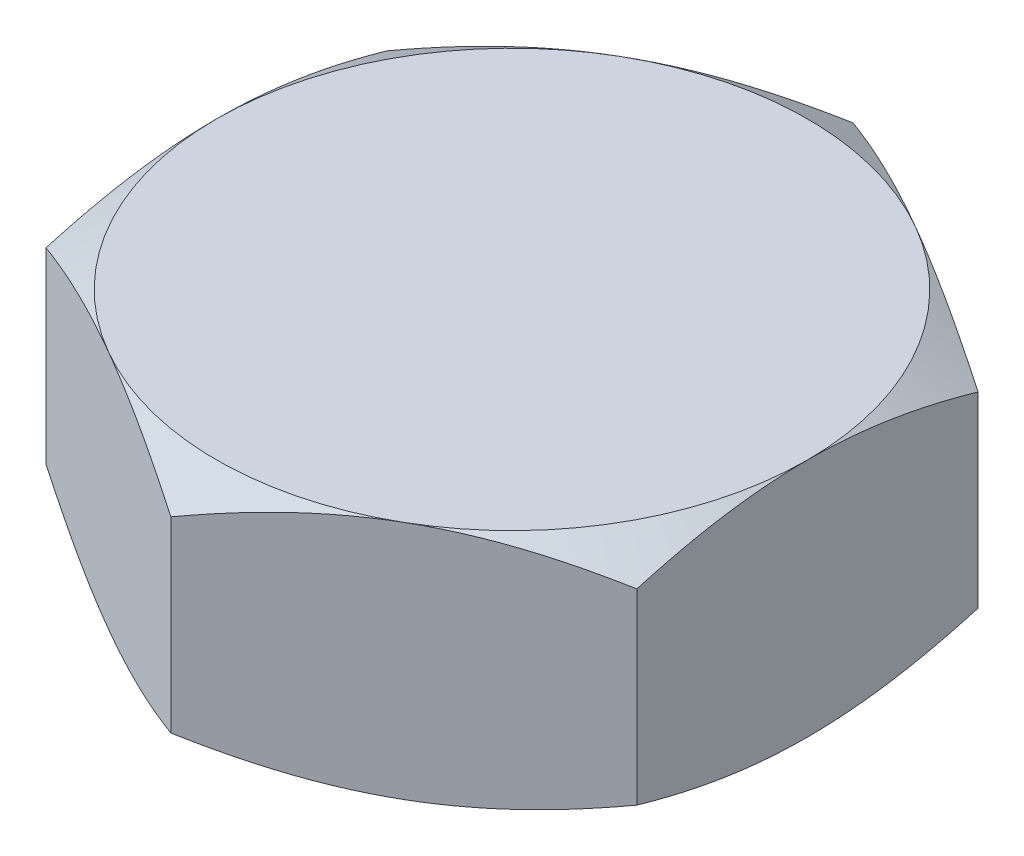
ISO-10303-21;
HEADER;
FILE_DESCRIPTION(('STEP AP214'),'2;1');
FILE_NAME('part.step','',(''),(''),'','','');
FILE_SCHEMA(('AUTOMOTIVE_DESIGN { 1 0 10303 214 1 1 1 1 }'));
ENDSEC;
DATA;
#1=APPLICATION_CONTEXT('core data for automotive mechanical design processes');
#2=APPLICATION_PROTOCOL_DEFINITION('international standard','automotive_design',2000,#1);
#3=PRODUCT_CONTEXT('',#1,'mechanical');
#4=PRODUCT('Part','Part','',(#3));
#5=PRODUCT_RELATED_PRODUCT_CATEGORY('part','',(#4));
#6=PRODUCT_DEFINITION_FORMATION('','',#4);
#7=PRODUCT_DEFINITION_CONTEXT('part definition',#1,'design');
#8=PRODUCT_DEFINITION('design','',#6,#7);
#9=PRODUCT_DEFINITION_SHAPE('','',#8);
#10=(LENGTH_UNIT() NAMED_UNIT(*) SI_UNIT(.MILLI.,.METRE.));
#11=(NAMED_UNIT(*) PLANE_ANGLE_UNIT() SI_UNIT($,.RADIAN.));
#12=(NAMED_UNIT(*) SI_UNIT($,.STERADIAN.) SOLID_ANGLE_UNIT());
#13=UNCERTAINTY_MEASURE_WITH_UNIT(LENGTH_MEASURE(1.E-05),#10,'distance_accuracy_value','');
#14=(GEOMETRIC_REPRESENTATION_CONTEXT(3) GLOBAL_UNCERTAINTY_ASSIGNED_CONTEXT((#13)) GLOBAL_UNIT_ASSIGNED_CONTEXT((#10,
#11,#12)) REPRESENTATION_CONTEXT('',''));
#15=CARTESIAN_POINT('',(0.,0.,0.));
#16=DIRECTION('',(0.,0.,1.));
#17=DIRECTION('',(1.,0.,0.));
#18=AXIS2_PLACEMENT_3D('',#15,#16,#17);
#19=CARTESIAN_POINT('',(93.000000000009,-97.5999999999906,31.000000000003));
#20=DIRECTION('',(0.,1.,0.));
#21=DIRECTION('',(0.,0.,1.));
#22=AXIS2_PLACEMENT_3D('',#19,#20,#21);
#23=PLANE('',#22);
#24=CARTESIAN_POINT('',(93.000000000009,-97.6000000000392,31.000000000003));
#25=DIRECTION('',(0.,1.,0.));
#26=DIRECTION('',(-1.,0.,0.));
#27=AXIS2_PLACEMENT_3D('',#24,#25,#26);
#28=CIRCLE('',#27,1.59999999999918);
#29=CARTESIAN_POINT('',(92.2000000000018,-97.6000000000392,29.6143593539503));
#30=VERTEX_POINT('',#29);
#31=CARTESIAN_POINT('',(91.39999999999,-97.5999999999766,31.000000000003));
#32=VERTEX_POINT('',#31);
#33=EDGE_CURVE('E109',#30,#32,#28,.T.);
#34=ORIENTED_EDGE('',*,*,#33,.F.);
#35=CARTESIAN_POINT('',(93.000000000009,-97.6000000000392,31.000000000003));
#36=DIRECTION('',(0.,1.,0.));
#37=DIRECTION('',(-1.,0.,0.));
#38=AXIS2_PLACEMENT_3D('',#35,#36,#37);
#39=CIRCLE('',#38,1.59999999999918);
#40=CARTESIAN_POINT('',(93.7999999999972,-97.6000000000392,29.6143593539393));
#41=VERTEX_POINT('',#40);
#42=EDGE_CURVE('E106',#41,#30,#39,.T.);
#43=ORIENTED_EDGE('',*,*,#42,.F.);
#44=CARTESIAN_POINT('',(93.000000000009,-97.6000000000392,31.000000000003));
#45=DIRECTION('',(0.,1.,0.));
#46=DIRECTION('',(-1.,0.,0.));
#47=AXIS2_PLACEMENT_3D('',#44,#45,#46);
#48=CIRCLE('',#47,1.59999999999918);
#49=CARTESIAN_POINT('',(94.6000000000026,-97.6000000000003,30.9999999999903));
#50=VERTEX_POINT('',#49);
#51=EDGE_CURVE('E22',#50,#41,#48,.T.);
#52=ORIENTED_EDGE('',*,*,#51,.F.);
#53=CARTESIAN_POINT('',(93.000000000009,-97.5999999999583,31.000000000003));
#54=DIRECTION('',(0.,1.,0.));
#55=DIRECTION('',(0.,0.,1.));
#56=AXIS2_PLACEMENT_3D('',#53,#54,#55);
#57=CIRCLE('',#56,1.59999999994234);
#58=CARTESIAN_POINT('',(93.799999999998,-97.5999999999867,32.3856406460334));
#59=VERTEX_POINT('',#58);
#60=EDGE_CURVE('E401',#59,#50,#57,.T.);
#61=ORIENTED_EDGE('',*,*,#60,.F.);
#62=CARTESIAN_POINT('',(93.000000000009,-97.6000000000151,31.000000000003));
#63=DIRECTION('',(0.,1.,0.));
#64=DIRECTION('',(-1.,0.,0.));
#65=AXIS2_PLACEMENT_3D('',#62,#63,#64);
#66=CIRCLE('',#65,1.59999999999918);
#67=CARTESIAN_POINT('',(92.2000000000081,-97.5999999999867,32.3856406460667));
#68=VERTEX_POINT('',#67);
#69=EDGE_CURVE('E398',#68,#59,#66,.T.);
#70=ORIENTED_EDGE('',*,*,#69,.F.);
#71=CARTESIAN_POINT('',(93.000000000009,-97.5999999999583,31.000000000003));
#72=DIRECTION('',(0.,1.,0.));
#73=DIRECTION('',(0.,0.,1.));
#74=AXIS2_PLACEMENT_3D('',#71,#72,#73);
#75=CIRCLE('',#74,1.59999999994234);
#76=EDGE_CURVE('E397',#32,#68,#75,.T.);
#77=ORIENTED_EDGE('',*,*,#76,.F.);
#78=EDGE_LOOP('',(#34,#43,#52,#61,#70,#77));
#79=FACE_BOUND('',#78,.T.);
#80=ADVANCED_FACE('F19',(#79),#23,.F.);
#81=CARTESIAN_POINT('',(93.000000000009,-97.4562363267069,31.000000000003));
#82=DIRECTION('',(0.,1.,0.));
#83=DIRECTION('',(-1.,0.,0.));
#84=AXIS2_PLACEMENT_3D('',#81,#82,#83);
#85=CONICAL_SURFACE('',#84,1.8490059865173,1.04719755123802);
#86=CARTESIAN_POINT('',(94.6000000000026,-97.6000000000424,30.9999999999776));
#87=CARTESIAN_POINT('',(94.6000000000026,-97.6000050000491,30.960789262922));
#88=CARTESIAN_POINT('',(94.6000000000026,-97.5991672976013,30.921583848267));
#89=CARTESIAN_POINT('',(94.6000000000026,-97.5958504720171,30.843250000913));
#90=CARTESIAN_POINT('',(94.6000000000026,-97.5933716738303,30.8041215545117));
#91=CARTESIAN_POINT('',(94.6000000000026,-97.5835729351368,30.6873314076139));
#92=CARTESIAN_POINT('',(94.6000000000026,-97.5738897119844,30.6098586984215));
#93=CARTESIAN_POINT('',(94.6000000000026,-97.5489890329253,30.4559347936088));
#94=CARTESIAN_POINT('',(94.6000000000026,-97.5337777492636,30.3794825569155));
#95=CARTESIAN_POINT('',(94.6000000000026,-97.498696885759,30.2272356935514));
#96=CARTESIAN_POINT('',(94.6000000000026,-97.4788040416012,30.1514463781777));
#97=CARTESIAN_POINT('',(94.6000000000026,-97.4570937640867,30.0762395692803));
#98=B_SPLINE_CURVE_WITH_KNOTS('',3,(#86,#87,#88,#89,#90,#91,#92,#93,#94,#95,#96,#97),
.UNSPECIFIED.,.F.,.F.,(4,2,2,2,2,4),(0.,0.117613340319049,0.235203399264602,0.469168717668109,
0.702873605354114,0.937765336037053),.UNSPECIFIED.);
#99=CARTESIAN_POINT('',(94.6000000000098,-97.4570937640856,30.0762395692888));
#100=VERTEX_POINT('',#99);
#101=EDGE_CURVE('E121',#50,#100,#98,.T.);
#102=ORIENTED_EDGE('',*,*,#101,.F.);
#103=ORIENTED_EDGE('',*,*,#51,.T.);
#104=CARTESIAN_POINT('',(93.7999999999867,-97.6000000000365,29.6143593539306));
#105=CARTESIAN_POINT('',(93.8339574943794,-97.6000050000439,29.6339647224592));
#106=CARTESIAN_POINT('',(93.8679103794381,-97.5991672975967,29.6535674297875));
#107=CARTESIAN_POINT('',(93.9357494812258,-97.5958504720138,29.6927343534662));
#108=CARTESIAN_POINT('',(93.9696357098214,-97.5933716738275,29.7122985766677));
#109=CARTESIAN_POINT('',(94.0707789439511,-97.5835729351353,29.7706936501191));
#110=CARTESIAN_POINT('',(94.1378722782148,-97.5738897119835,29.8094300047169));
#111=CARTESIAN_POINT('',(94.2711742900382,-97.548989032925,29.8863919571266));
#112=CARTESIAN_POINT('',(94.3373838691937,-97.5337777492634,29.9246180754749));
#113=CARTESIAN_POINT('',(94.4692335205194,-97.4986968857584,30.0007415071602));
#114=CARTESIAN_POINT('',(94.5348689929713,-97.4788040416001,30.0386361648487));
#115=CARTESIAN_POINT('',(94.6000000000169,-97.457093764085,30.076239569299));
#116=B_SPLINE_CURVE_WITH_KNOTS('',3,(#104,#105,#106,#107,#108,#109,#110,#111,#112,#113,#114,
#115),.UNSPECIFIED.,.F.,.F.,(4,2,2,2,2,4),(0.,0.117613340324093,0.235203399274711,
0.469168717688132,0.702873605384009,0.937765336077022),.UNSPECIFIED.);
#117=EDGE_CURVE('E120',#41,#100,#116,.T.);
#118=ORIENTED_EDGE('',*,*,#117,.T.);
#119=EDGE_LOOP('',(#102,#103,#118));
#120=FACE_BOUND('',#119,.T.);
#121=ADVANCED_FACE('F125',(#120),#85,.T.);
#122=CARTESIAN_POINT('',(93.000000000009,-97.4562363267069,31.000000000003));
#123=DIRECTION('',(0.,1.,0.));
#124=DIRECTION('',(-1.,0.,0.));
#125=AXIS2_PLACEMENT_3D('',#122,#123,#124);
#126=CONICAL_SURFACE('',#125,1.8490059865173,1.04719755123802);
#127=CARTESIAN_POINT('',(92.9999999999939,-97.4570937640777,29.1524791385939));
#128=CARTESIAN_POINT('',(93.0651310070383,-97.4788040415953,29.190082543037));
#129=CARTESIAN_POINT('',(93.1307664794878,-97.4986968857542,29.2279772007214));
#130=CARTESIAN_POINT('',(93.2626161308075,-97.5337777492593,29.3041006324014));
#131=CARTESIAN_POINT('',(93.3288257099595,-97.5489890329203,29.3423267507483));
#132=CARTESIAN_POINT('',(93.4621277217759,-97.5738897119787,29.4192887031545));
#133=CARTESIAN_POINT('',(93.5292210560361,-97.583572935131,29.4580250577501));
#134=CARTESIAN_POINT('',(93.6303642901606,-97.5933716738244,29.5164201311984));
#135=CARTESIAN_POINT('',(93.6642505187545,-97.5958504720112,29.5359843543989));
#136=CARTESIAN_POINT('',(93.7320896205388,-97.5991672975953,29.5751512780756));
#137=CARTESIAN_POINT('',(93.7660425055957,-97.6000050000431,29.594753985403));
#138=CARTESIAN_POINT('',(93.7999999999867,-97.6000000000365,29.6143593539306));
#139=B_SPLINE_CURVE_WITH_KNOTS('',3,(#127,#128,#129,#130,#131,#132,#133,#134,#135,#136,#137,
#138),.UNSPECIFIED.,.F.,.F.,(4,2,2,2,2,4),(0.,0.234891730681497,0.468596618365947,
0.702561936767566,0.820151995712265,0.937765336030501),.UNSPECIFIED.);
#140=CARTESIAN_POINT('',(93.0000000000093,-97.4570937640829,29.1524791385854));
#141=VERTEX_POINT('',#140);
#142=EDGE_CURVE('E114',#141,#41,#139,.T.);
#143=ORIENTED_EDGE('',*,*,#142,.T.);
#144=ORIENTED_EDGE('',*,*,#42,.T.);
#145=CARTESIAN_POINT('',(92.1999999999931,-97.6000000000365,29.6143593539526));
#146=CARTESIAN_POINT('',(92.2339574943857,-97.6000050000438,29.5947539854241));
#147=CARTESIAN_POINT('',(92.2679103794442,-97.5991672975965,29.5751512780958));
#148=CARTESIAN_POINT('',(92.3357494812317,-97.5958504720133,29.5359843544173));
#149=CARTESIAN_POINT('',(92.3696357098272,-97.5933716738269,29.5164201312159));
#150=CARTESIAN_POINT('',(92.4707789439565,-97.5835729351344,29.4580250577647));
#151=CARTESIAN_POINT('',(92.5378722782199,-97.5738897119824,29.419288703167));
#152=CARTESIAN_POINT('',(92.6711742900428,-97.5489890329236,29.3423267507576));
#153=CARTESIAN_POINT('',(92.737383869198,-97.5337777492619,29.3041006324095));
#154=CARTESIAN_POINT('',(92.8692335205232,-97.4986968857567,29.2279772007245));
#155=CARTESIAN_POINT('',(92.9348689929749,-97.4788040415984,29.1900825430362));
#156=CARTESIAN_POINT('',(93.0000000000202,-97.4570937640832,29.152479138586));
#157=B_SPLINE_CURVE_WITH_KNOTS('',3,(#145,#146,#147,#148,#149,#150,#151,#152,#153,#154,#155,
#156),.UNSPECIFIED.,.F.,.F.,(4,2,2,2,2,4),(0.,0.117613340323682,0.235203399273859,
0.469168717686455,0.702873605381514,0.937765336073664),.UNSPECIFIED.);
#158=EDGE_CURVE('E116',#30,#141,#157,.T.);
#159=ORIENTED_EDGE('',*,*,#158,.T.);
#160=EDGE_LOOP('',(#143,#144,#159));
#161=FACE_BOUND('',#160,.T.);
#162=ADVANCED_FACE('F115',(#161),#126,.T.);
#163=CARTESIAN_POINT('',(93.000000000009,-97.4562363267069,31.000000000003));
#164=DIRECTION('',(0.,1.,0.));
#165=DIRECTION('',(-1.,0.,0.));
#166=AXIS2_PLACEMENT_3D('',#163,#164,#165);
#167=CONICAL_SURFACE('',#166,1.8490059865173,1.04719755123802);
#168=CARTESIAN_POINT('',(91.3999999999871,-97.4570937640758,30.0762395693134));
#169=CARTESIAN_POINT('',(91.4651310070288,-97.4788040415929,30.0386361648613));
#170=CARTESIAN_POINT('',(91.5307664794781,-97.498696885752,30.0007415071727));
#171=CARTESIAN_POINT('',(91.6626161307997,-97.5337777492578,29.9246180754885));
#172=CARTESIAN_POINT('',(91.7288257099538,-97.5489890329195,29.8863919571415));
#173=CARTESIAN_POINT('',(91.8621277217739,-97.5738897119787,29.809430004734));
#174=CARTESIAN_POINT('',(91.9292210560357,-97.5835729351313,29.7706936501371));
#175=CARTESIAN_POINT('',(92.0303642901627,-97.5933716738247,29.7122985766872));
#176=CARTESIAN_POINT('',(92.0642505187574,-97.5958504720115,29.6927343534862));
#177=CARTESIAN_POINT('',(92.1320896205435,-97.5991672975955,29.6535674298086));
#178=CARTESIAN_POINT('',(92.1660425056013,-97.6000050000432,29.6339647224807));
#179=CARTESIAN_POINT('',(92.1999999999931,-97.6000000000365,29.6143593539526));
#180=B_SPLINE_CURVE_WITH_KNOTS('',3,(#168,#169,#170,#171,#172,#173,#174,#175,#176,#177,#178,
#179),.UNSPECIFIED.,.F.,.F.,(4,2,2,2,2,4),(0.,0.234891730687356,0.468596618377605,
0.702561936785193,0.820151995732866,0.937765336054062),.UNSPECIFIED.);
#181=CARTESIAN_POINT('',(91.3999999999867,-97.4570937640775,30.076239569298));
#182=VERTEX_POINT('',#181);
#183=EDGE_CURVE('E133',#182,#30,#180,.T.);
#184=ORIENTED_EDGE('',*,*,#183,.T.);
#185=ORIENTED_EDGE('',*,*,#33,.T.);
#186=CARTESIAN_POINT('',(91.39999999999,-97.6000000000277,31.000000000003));
#187=CARTESIAN_POINT('',(91.39999999999,-97.6000050000348,30.9607892629467));
#188=CARTESIAN_POINT('',(91.39999999999,-97.5991672975873,30.9215838482909));
#189=CARTESIAN_POINT('',(91.39999999999,-97.5958504720038,30.8432500009353));
#190=CARTESIAN_POINT('',(91.39999999999,-97.5933716738172,30.8041215545332));
#191=CARTESIAN_POINT('',(91.39999999999,-97.5835729351245,30.6873314076331));
#192=CARTESIAN_POINT('',(91.39999999999,-97.5738897119726,30.6098586984391));
#193=CARTESIAN_POINT('',(91.39999999999,-97.5489890329141,30.4559347936232));
#194=CARTESIAN_POINT('',(91.39999999999,-97.5337777492527,30.3794825569283));
#195=CARTESIAN_POINT('',(91.39999999999,-97.4986968857483,30.227235693561));
#196=CARTESIAN_POINT('',(91.39999999999,-97.4788040415905,30.1514463781857));
#197=CARTESIAN_POINT('',(91.39999999999,-97.4570937640759,30.0762395692868));
#198=B_SPLINE_CURVE_WITH_KNOTS('',3,(#186,#187,#188,#189,#190,#191,#192,#193,#194,#195,#196,
#197),.UNSPECIFIED.,.F.,.F.,(4,2,2,2,2,4),(0.,0.117613340321352,0.235203399269211,
0.469168717677262,0.702873605367804,0.937765336055343),.UNSPECIFIED.);
#199=EDGE_CURVE('E265',#32,#182,#198,.T.);
#200=ORIENTED_EDGE('',*,*,#199,.T.);
#201=EDGE_LOOP('',(#184,#185,#200));
#202=FACE_BOUND('',#201,.T.);
#203=ADVANCED_FACE('F248',(#202),#167,.T.);
#204=CARTESIAN_POINT('',(93.000000000009,-97.45623632665,31.000000000003));
#205=DIRECTION('',(0.,1.,0.));
#206=DIRECTION('',(0.,0.,1.));
#207=AXIS2_PLACEMENT_3D('',#204,#205,#206);
#208=CONICAL_SURFACE('',#207,1.84900598640361,1.04719755121154);
#209=CARTESIAN_POINT('',(91.3999999999744,-97.457093763971,31.923760430694));
#210=CARTESIAN_POINT('',(91.3999999999844,-97.4788040414796,31.8485536217957));
#211=CARTESIAN_POINT('',(91.3999999999885,-97.4986968856351,31.772764306422));
#212=CARTESIAN_POINT('',(91.3999999999915,-97.533777749138,31.6205174430584));
#213=CARTESIAN_POINT('',(91.3999999999904,-97.5489890328002,31.5440652063658));
#214=CARTESIAN_POINT('',(91.3999999999896,-97.5738897118593,31.3901413015539));
#215=CARTESIAN_POINT('',(91.3999999999899,-97.5835729350111,31.3126685923617));
#216=CARTESIAN_POINT('',(91.39999999999,-97.5933716737037,31.1958784454643));
#217=CARTESIAN_POINT('',(91.39999999999,-97.5958504718902,31.1567499990632));
#218=CARTESIAN_POINT('',(91.39999999999,-97.5991672974737,31.0784161517096));
#219=CARTESIAN_POINT('',(91.39999999999,-97.6000049999212,31.0392107370548));
#220=CARTESIAN_POINT('',(91.39999999999,-97.599999999914,30.9999999999994));
#221=B_SPLINE_CURVE_WITH_KNOTS('',3,(#209,#210,#211,#212,#213,#214,#215,#216,#217,#218,#219,
#220),.UNSPECIFIED.,.F.,.F.,(4,2,2,2,2,4),(0.,0.234891730681337,0.468596618365885,
0.702561936768438,0.820151995713441,0.937765336031873),.UNSPECIFIED.);
#222=CARTESIAN_POINT('',(91.3999999999984,-97.4570937639609,31.9237604307081));
#223=VERTEX_POINT('',#222);
#224=EDGE_CURVE('E253',#223,#32,#221,.T.);
#225=ORIENTED_EDGE('',*,*,#224,.T.);
#226=ORIENTED_EDGE('',*,*,#76,.T.);
#227=CARTESIAN_POINT('',(91.3999999999976,-97.4570937639688,31.9237604307361));
#228=CARTESIAN_POINT('',(91.4651310070465,-97.4788040414785,31.9613638351777));
#229=CARTESIAN_POINT('',(91.5307664794982,-97.4986968856346,31.9992584928618));
#230=CARTESIAN_POINT('',(91.6626161308207,-97.5337777491384,32.0753819245421));
#231=CARTESIAN_POINT('',(91.7288257099731,-97.5489890328009,32.1136080428898));
#232=CARTESIAN_POINT('',(91.8621277217915,-97.5738897118604,32.1905699952973));
#233=CARTESIAN_POINT('',(91.929221056053,-97.5835729350124,32.2293063498937));
#234=CARTESIAN_POINT('',(92.0303642901793,-97.5933716737052,32.287701423343));
#235=CARTESIAN_POINT('',(92.0642505187738,-97.5958504718918,32.3072656465438));
#236=CARTESIAN_POINT('',(92.1320896205592,-97.5991672974752,32.3464325702212));
#237=CARTESIAN_POINT('',(92.1660425056166,-97.6000049999226,32.3660352775488));
#238=CARTESIAN_POINT('',(92.2000000000082,-97.5999999999155,32.3856406460767));
#239=B_SPLINE_CURVE_WITH_KNOTS('',3,(#227,#228,#229,#230,#231,#232,#233,#234,#235,#236,#237,
#238),.UNSPECIFIED.,.F.,.F.,(4,2,2,2,2,4),(0.,0.234891730684658,0.468596618372424,
0.702561936778174,0.820151995724823,0.937765336044905),.UNSPECIFIED.);
#240=EDGE_CURVE('E259',#223,#68,#239,.T.);
#241=ORIENTED_EDGE('',*,*,#240,.F.);
#242=EDGE_LOOP('',(#225,#226,#241));
#243=FACE_BOUND('',#242,.T.);
#244=ADVANCED_FACE('F243',(#243),#208,.T.);
#245=CARTESIAN_POINT('',(93.000000000009,-97.4562363267069,31.000000000003));
#246=DIRECTION('',(0.,1.,0.));
#247=DIRECTION('',(-1.,0.,0.));
#248=AXIS2_PLACEMENT_3D('',#245,#246,#247);
#249=CONICAL_SURFACE('',#248,1.84900598640361,1.04719755111269);
#250=CARTESIAN_POINT('',(92.2000000000058,-97.6000000000051,32.3856406460754));
#251=CARTESIAN_POINT('',(92.2339574943972,-97.6000050000121,32.4052460146033));
#252=CARTESIAN_POINT('',(92.2679103794546,-97.5991672975643,32.4248487219308));
#253=CARTESIAN_POINT('',(92.3357494812396,-97.5958504719798,32.4640156456079));
#254=CARTESIAN_POINT('',(92.3696357098338,-97.5933716737926,32.4835798688086));
#255=CARTESIAN_POINT('',(92.4707789439592,-97.5835729350972,32.5419749422575));
#256=CARTESIAN_POINT('',(92.5378722782198,-97.5738897119426,32.5807112968536));
#257=CARTESIAN_POINT('',(92.6711742900367,-97.5489890328778,32.6576732492595));
#258=CARTESIAN_POINT('',(92.7373838691887,-97.5337777492125,32.6958993676058));
#259=CARTESIAN_POINT('',(92.8692335205072,-97.4986968856995,32.772022799287));
#260=CARTESIAN_POINT('',(92.9348689929554,-97.4788040415368,32.8099174569733));
#261=CARTESIAN_POINT('',(92.9999999999971,-97.4570937640171,32.8475208614213));
#262=B_SPLINE_CURVE_WITH_KNOTS('',3,(#250,#251,#252,#253,#254,#255,#256,#257,#258,#259,#260,
#261),.UNSPECIFIED.,.F.,.F.,(4,2,2,2,2,4),(0.,0.117613340319552,0.23520339926558,
0.469168717669395,0.70287360535558,0.937765336039341),.UNSPECIFIED.);
#263=CARTESIAN_POINT('',(93.0000000000046,-97.4570937640198,32.8475208614165));
#264=VERTEX_POINT('',#263);
#265=EDGE_CURVE('E234',#68,#264,#262,.T.);
#266=ORIENTED_EDGE('',*,*,#265,.F.);
#267=ORIENTED_EDGE('',*,*,#69,.T.);
#268=CARTESIAN_POINT('',(93.0000000000121,-97.4570937640226,32.8475208614117));
#269=CARTESIAN_POINT('',(93.0651310070548,-97.4788040415429,32.8099174569631));
#270=CARTESIAN_POINT('',(93.1307664795041,-97.498696885706,32.7720227992762));
#271=CARTESIAN_POINT('',(93.2626161308248,-97.5337777492198,32.6958993675937));
#272=CARTESIAN_POINT('',(93.3288257099779,-97.5489890328854,32.6576732492468));
#273=CARTESIAN_POINT('',(93.4621277217971,-97.5738897119506,32.5807112968396));
#274=CARTESIAN_POINT('',(93.5292210560588,-97.5835729351052,32.5419749422428));
#275=CARTESIAN_POINT('',(93.6303642901858,-97.5933716738005,32.483579868793));
#276=CARTESIAN_POINT('',(93.6642505187807,-97.5958504719877,32.4640156455919));
#277=CARTESIAN_POINT('',(93.7320896205669,-97.599167297572,32.4248487219141));
#278=CARTESIAN_POINT('',(93.7660425056248,-97.6000050000196,32.4052460145862));
#279=CARTESIAN_POINT('',(93.8000000000168,-97.6000000000124,32.3856406460581));
#280=B_SPLINE_CURVE_WITH_KNOTS('',3,(#268,#269,#270,#271,#272,#273,#274,#275,#276,#277,#278,
#279),.UNSPECIFIED.,.F.,.F.,(4,2,2,2,2,4),(0.,0.234891730687764,0.468596618377839,
0.702561936785577,0.820151995733628,0.937765336055195),.UNSPECIFIED.);
#281=EDGE_CURVE('E227',#264,#59,#280,.T.);
#282=ORIENTED_EDGE('',*,*,#281,.F.);
#283=EDGE_LOOP('',(#266,#267,#282));
#284=FACE_BOUND('',#283,.T.);
#285=ADVANCED_FACE('F239',(#284),#249,.T.);
#286=CARTESIAN_POINT('',(93.000000000009,-97.45623632665,31.000000000003));
#287=DIRECTION('',(0.,1.,0.));
#288=DIRECTION('',(0.,0.,1.));
#289=AXIS2_PLACEMENT_3D('',#286,#287,#288);
#290=CONICAL_SURFACE('',#289,1.84900598640361,1.04719755121154);
#291=CARTESIAN_POINT('',(93.8000000000242,-97.5999999999314,32.3856406460709));
#292=CARTESIAN_POINT('',(93.8339574944097,-97.6000049999329,32.3660352775357));
#293=CARTESIAN_POINT('',(93.8679103794638,-97.599167297483,32.3464325702053));
#294=CARTESIAN_POINT('',(93.9357494812452,-97.5958504718977,32.3072656465269));
#295=CARTESIAN_POINT('',(93.9696357098389,-97.5933716737116,32.2877014233277));
#296=CARTESIAN_POINT('',(94.0707789439622,-97.5835729350197,32.2293063498817));
#297=CARTESIAN_POINT('',(94.1378722782207,-97.5738897118674,32.190569995286));
#298=CARTESIAN_POINT('',(94.2711742900346,-97.5489890328087,32.1136080428811));
#299=CARTESIAN_POINT('',(94.3373838691856,-97.5337777491474,32.0753819245356));
#300=CARTESIAN_POINT('',(94.4692335205023,-97.4986968856435,31.9992584928558));
#301=CARTESIAN_POINT('',(94.5348689929497,-97.4788040414859,31.9613638351702));
#302=CARTESIAN_POINT('',(94.5999999999905,-97.4570937639714,31.9237604307223));
#303=B_SPLINE_CURVE_WITH_KNOTS('',3,(#291,#292,#293,#294,#295,#296,#297,#298,#299,#300,#301,
#302),.UNSPECIFIED.,.F.,.F.,(4,2,2,2,2,4),(0.,0.117613340315616,0.235203399257924,
0.469168717655181,0.702873605335453,0.937765336012427),.UNSPECIFIED.);
#304=CARTESIAN_POINT('',(94.6000000000036,-97.45709376397,31.9237604307044));
#305=VERTEX_POINT('',#304);
#306=EDGE_CURVE('E221',#59,#305,#303,.T.);
#307=ORIENTED_EDGE('',*,*,#306,.F.);
#308=ORIENTED_EDGE('',*,*,#60,.T.);
#309=CARTESIAN_POINT('',(94.6000000000159,-97.4570937639813,31.923760430697));
#310=CARTESIAN_POINT('',(94.6000000000073,-97.4788040414919,31.8485536217966));
#311=CARTESIAN_POINT('',(94.6000000000039,-97.4986968856486,31.7727643064206));
#312=CARTESIAN_POINT('',(94.6000000000013,-97.5337777491531,31.6205174430525));
#313=CARTESIAN_POINT('',(94.6000000000023,-97.5489890328157,31.5440652063574));
#314=CARTESIAN_POINT('',(94.6000000000029,-97.5738897118754,31.3901413015407));
#315=CARTESIAN_POINT('',(94.6000000000027,-97.5835729350273,31.3126685923461));
#316=CARTESIAN_POINT('',(94.6000000000026,-97.5933716737196,31.195878445445));
#317=CARTESIAN_POINT('',(94.6000000000026,-97.595850471906,31.1567499990427));
#318=CARTESIAN_POINT('',(94.6000000000026,-97.599167297489,31.0784161516865));
#319=CARTESIAN_POINT('',(94.6000000000026,-97.6000049999362,31.0392107370305));
#320=CARTESIAN_POINT('',(94.6000000000026,-97.5999999999287,30.9999999999738));
#321=B_SPLINE_CURVE_WITH_KNOTS('',3,(#309,#310,#311,#312,#313,#314,#315,#316,#317,#318,#319,
#320),.UNSPECIFIED.,.F.,.F.,(4,2,2,2,2,4),(0.,0.234891730688791,0.468596618380592,
0.702561936790384,0.820151995739099,0.937765336061252),.UNSPECIFIED.);
#322=EDGE_CURVE('E161',#305,#50,#321,.T.);
#323=ORIENTED_EDGE('',*,*,#322,.F.);
#324=EDGE_LOOP('',(#307,#308,#323));
#325=FACE_BOUND('',#324,.T.);
#326=ADVANCED_FACE('F170',(#325),#290,.T.);
#327=CARTESIAN_POINT('',(94.6000000000026,-96.9499999999932,31.000000000003));
#328=DIRECTION('',(1.,0.,0.));
#329=DIRECTION('',(0.,0.,-1.));
#330=AXIS2_PLACEMENT_3D('',#327,#328,#329);
#331=PLANE('',#330);
#332=ORIENTED_EDGE('',*,*,#322,.T.);
#333=ORIENTED_EDGE('',*,*,#101,.T.);
#334=DIRECTION('',(0.,1.,0.));
#335=VECTOR('',#334,1.);
#336=CARTESIAN_POINT('',(94.6000000000046,-96.9499999999932,30.0762395692919));
#337=LINE('',#336,#335);
#338=CARTESIAN_POINT('',(94.6000000144386,-96.4429062407499,30.0762395776253));
#339=VERTEX_POINT('',#338);
#340=EDGE_CURVE('E131',#100,#339,#337,.T.);
#341=ORIENTED_EDGE('',*,*,#340,.T.);
#342=CARTESIAN_POINT('',(94.6000000000021,-96.2999999999768,30.9999999999808));
#343=CARTESIAN_POINT('',(94.6000000000024,-96.2999949999718,30.9607892667188));
#344=CARTESIAN_POINT('',(94.6000000000025,-96.3008327022564,30.9215838558558));
#345=CARTESIAN_POINT('',(94.6000000000026,-96.3041495272011,30.8432500160622));
#346=CARTESIAN_POINT('',(94.6000000000026,-96.306628324912,30.8041215734294));
#347=CARTESIAN_POINT('',(94.6000000000026,-96.3164270617441,30.6873314376907));
#348=CARTESIAN_POINT('',(94.6000000000026,-96.3261102830772,30.6098587358354));
#349=CARTESIAN_POINT('',(94.6000000000026,-96.351010957618,30.4559348454272));
#350=CARTESIAN_POINT('',(94.6000000000026,-96.3662222385834,30.379482615802));
#351=CARTESIAN_POINT('',(94.6000000000026,-96.4013030960697,30.227235766443));
#352=CARTESIAN_POINT('',(94.6000000000026,-96.4211959368993,30.1514464580046));
#353=CARTESIAN_POINT('',(94.6000000000026,-96.4429062109245,30.0762396559396));
#354=B_SPLINE_CURVE_WITH_KNOTS('',3,(#342,#343,#344,#345,#346,#347,#348,#349,#350,#351,#352,
#353),.UNSPECIFIED.,.F.,.F.,(4,2,2,2,2,4),(0.,0.117613328943766,0.235203376525097,
0.469168672477424,0.702873537815195,0.937765245876373),.UNSPECIFIED.);
#355=CARTESIAN_POINT('',(94.6000000000025,-96.2999999999929,30.9999999999792));
#356=VERTEX_POINT('',#355);
#357=EDGE_CURVE('E185',#356,#339,#354,.T.);
#358=ORIENTED_EDGE('',*,*,#357,.F.);
#359=CARTESIAN_POINT('',(94.5999999624887,-96.4429062682742,31.9237604574775));
#360=CARTESIAN_POINT('',(94.5999999865812,-96.4211959746843,31.8485536495331));
#361=CARTESIAN_POINT('',(94.5999999964192,-96.4013031232063,31.7727643328082));
#362=CARTESIAN_POINT('',(94.6000000035678,-96.3662222530216,31.6205174649181));
#363=CARTESIAN_POINT('',(94.6000000009415,-96.351010969946,31.5440652250639));
#364=CARTESIAN_POINT('',(94.5999999990627,-96.3261102904129,31.3901413147495));
#365=CARTESIAN_POINT('',(94.599999999814,-96.3164270661714,31.3126686032214));
#366=CARTESIAN_POINT('',(94.6000000000974,-96.3066283266385,31.1958784525202));
#367=CARTESIAN_POINT('',(94.60000000005,-96.3041495283048,31.1567500047362));
#368=CARTESIAN_POINT('',(94.5999999999552,-96.3008327025392,31.0784161545562));
#369=CARTESIAN_POINT('',(94.5999999999078,-96.299995000059,31.0392107384578));
#370=CARTESIAN_POINT('',(94.6000000000026,-96.3000000000093,30.9999999999808));
#371=B_SPLINE_CURVE_WITH_KNOTS('',3,(#359,#360,#361,#362,#363,#364,#365,#366,#367,#368,#369,
#370),.UNSPECIFIED.,.F.,.F.,(4,2,2,2,2,4),(0.,0.23489174012617,0.468596636469668,
0.70256196239349,0.82015202548643,0.937765370112812),.UNSPECIFIED.);
#372=CARTESIAN_POINT('',(94.6000000000036,-96.442906240796,31.9237604473681));
#373=VERTEX_POINT('',#372);
#374=EDGE_CURVE('E177',#373,#356,#371,.T.);
#375=ORIENTED_EDGE('',*,*,#374,.F.);
#376=DIRECTION('',(0.,1.,0.));
#377=VECTOR('',#376,1.);
#378=CARTESIAN_POINT('',(94.6000000000046,-96.9499999999932,31.9237604307141));
#379=LINE('',#378,#377);
#380=EDGE_CURVE('E377',#305,#373,#379,.T.);
#381=ORIENTED_EDGE('',*,*,#380,.F.);
#382=EDGE_LOOP('',(#332,#333,#341,#358,#375,#381));
#383=FACE_BOUND('',#382,.T.);
#384=ADVANCED_FACE('F167',(#383),#331,.T.);
#385=CARTESIAN_POINT('',(93.8000000000058,-96.9499999999932,29.6143593539416));
#386=DIRECTION('',(-0.499999999999394,0.,0.866025403784789));
#387=DIRECTION('',(0.866025403784789,0.,0.499999999999394));
#388=AXIS2_PLACEMENT_3D('',#385,#386,#387);
#389=PLANE('',#388);
#390=CARTESIAN_POINT('',(93.7999999999867,-96.2999999999672,29.6143593539306));
#391=CARTESIAN_POINT('',(93.7660425066065,-96.2999949999612,29.5947539859865));
#392=CARTESIAN_POINT('',(93.73208962256,-96.3008327023588,29.5751512792425));
#393=CARTESIAN_POINT('',(93.6642505227901,-96.3041495277464,29.5359843567289));
#394=CARTESIAN_POINT('',(93.6303642952003,-96.3066283257869,29.5164201341081));
#395=CARTESIAN_POINT('',(93.5292210640491,-96.316427063908,29.4580250623764));
#396=CARTESIAN_POINT('',(93.4621277317439,-96.3261102865009,29.4192887089092));
#397=CARTESIAN_POINT('',(93.3288257237655,-96.3510109641705,29.3423267587195));
#398=CARTESIAN_POINT('',(93.2626161464967,-96.366222247003,29.3041006414605));
#399=CARTESIAN_POINT('',(93.1307664989096,-96.4013031086569,29.2279772119336));
#400=CARTESIAN_POINT('',(93.065131028309,-96.4211959517912,29.1900825553141));
#401=CARTESIAN_POINT('',(93.0000000230874,-96.4429062282326,29.1524791519168));
#402=B_SPLINE_CURVE_WITH_KNOTS('',3,(#390,#391,#392,#393,#394,#395,#396,#397,#398,#399,#400,
#401),.UNSPECIFIED.,.F.,.F.,(4,2,2,2,2,4),(0.,0.117613336818439,0.235203392266796,
0.469168703761147,0.702873584569664,0.937765308291031),.UNSPECIFIED.);
#403=CARTESIAN_POINT('',(93.7999999999983,-96.2999999999806,29.6143593539105));
#404=VERTEX_POINT('',#403);
#405=CARTESIAN_POINT('',(92.9999999884711,-96.4429062320795,29.1524791452539));
#406=VERTEX_POINT('',#405);
#407=EDGE_CURVE('E392',#404,#406,#402,.T.);
#408=ORIENTED_EDGE('',*,*,#407,.F.);
#409=CARTESIAN_POINT('',(94.6000000288726,-96.4429062455612,30.0762395859588));
#410=CARTESIAN_POINT('',(94.5348690195521,-96.4211959667027,30.0386361801951));
#411=CARTESIAN_POINT('',(94.469233544791,-96.4013031212631,30.0007415211734));
#412=CARTESIAN_POINT('',(94.337383888802,-96.3662222554411,29.9246180867957));
#413=CARTESIAN_POINT('',(94.271174307293,-96.3510109707415,29.8863919670886));
#414=CARTESIAN_POINT('',(94.1378722906729,-96.3261102899436,29.8094300119097));
#415=CARTESIAN_POINT('',(94.070778953966,-96.3164270660915,29.7706936559012));
#416=CARTESIAN_POINT('',(93.9696357161203,-96.3066283266828,29.7122985803043));
#417=CARTESIAN_POINT('',(93.9357494862697,-96.3041495283132,29.6927343563783));
#418=CARTESIAN_POINT('',(93.8679103819642,-96.3008327024842,29.653567431246));
#419=CARTESIAN_POINT('',(93.8339574956428,-96.2999949999743,29.6339647231886));
#420=CARTESIAN_POINT('',(93.7999999999867,-96.2999999999824,29.6143593539306));
#421=B_SPLINE_CURVE_WITH_KNOTS('',3,(#409,#410,#411,#412,#413,#414,#415,#416,#417,#418,#419,
#420),.UNSPECIFIED.,.F.,.F.,(4,2,2,2,2,4),(0.,0.234891739391817,0.46859663568115,
0.702561962727669,0.82015202604822,0.937765370746512),.UNSPECIFIED.);
#422=EDGE_CURVE('E192',#339,#404,#421,.T.);
#423=ORIENTED_EDGE('',*,*,#422,.F.);
#424=ORIENTED_EDGE('',*,*,#340,.F.);
#425=ORIENTED_EDGE('',*,*,#117,.F.);
#426=ORIENTED_EDGE('',*,*,#142,.F.);
#427=DIRECTION('',(0.,1.,0.));
#428=VECTOR('',#427,1.);
#429=CARTESIAN_POINT('',(93.000000000011,-96.9499999999932,29.1524791385913));
#430=LINE('',#429,#428);
#431=EDGE_CURVE('E341',#141,#406,#430,.T.);
#432=ORIENTED_EDGE('',*,*,#431,.T.);
#433=EDGE_LOOP('',(#408,#423,#424,#425,#426,#432));
#434=FACE_BOUND('',#433,.T.);
#435=ADVANCED_FACE('F129',(#434),#389,.F.);
#436=CARTESIAN_POINT('',(92.2000000000122,-96.9499999999932,29.6143593539416));
#437=DIRECTION('',(0.499999999999394,0.,0.866025403784789));
#438=DIRECTION('',(0.866025403784789,0.,-0.499999999999394));
#439=AXIS2_PLACEMENT_3D('',#436,#437,#438);
#440=PLANE('',#439);
#441=CARTESIAN_POINT('',(92.1999999999903,-96.2999999999792,29.6143593539477));
#442=CARTESIAN_POINT('',(92.1660425088859,-96.2999949999764,29.6339647205819));
#443=CARTESIAN_POINT('',(92.1320896271131,-96.3008327022619,29.6535674260149));
#444=CARTESIAN_POINT('',(92.0642505318758,-96.3041495272072,29.692734345913));
#445=CARTESIAN_POINT('',(92.0303643065448,-96.3066283249178,29.7122985672293));
#446=CARTESIAN_POINT('',(91.9292210820822,-96.3164270617494,29.7706936350987));
#447=CARTESIAN_POINT('',(91.862127754175,-96.3261102830828,29.8094299860269));
#448=CARTESIAN_POINT('',(91.7288257548308,-96.3510109576238,29.886391931232));
#449=CARTESIAN_POINT('',(91.6626161817986,-96.3662222385893,29.9246180460449));
#450=CARTESIAN_POINT('',(91.5307665426059,-96.4013030960759,30.0007414707251));
#451=CARTESIAN_POINT('',(91.4651310761622,-96.4211959369056,30.0386361249447));
#452=CARTESIAN_POINT('',(91.4000000750358,-96.4429062109311,30.0762395259776));
#453=B_SPLINE_CURVE_WITH_KNOTS('',3,(#441,#442,#443,#444,#445,#446,#447,#448,#449,#450,#451,
#452),.UNSPECIFIED.,.F.,.F.,(4,2,2,2,2,4),(0.,0.117613328944893,0.235203376527415,
0.469168672482239,0.702873537822717,0.93776524588649),.UNSPECIFIED.);
#454=CARTESIAN_POINT('',(92.1999999999931,-96.2999999999748,29.6143593539526));
#455=VERTEX_POINT('',#454);
#456=CARTESIAN_POINT('',(91.39999999999,-96.4429062407592,30.0762395526333));
#457=VERTEX_POINT('',#456);
#458=EDGE_CURVE('E321',#455,#457,#453,.T.);
#459=ORIENTED_EDGE('',*,*,#458,.F.);
#460=CARTESIAN_POINT('',(92.9999999769312,-96.4429062282328,29.1524791519165));
#461=CARTESIAN_POINT('',(92.9348689717064,-96.4211959517903,29.1900825553155));
#462=CARTESIAN_POINT('',(92.8692335011027,-96.4013031086551,29.2279772119369));
#463=CARTESIAN_POINT('',(92.7373838535092,-96.3662222470001,29.3041006414674));
#464=CARTESIAN_POINT('',(92.6711742762373,-96.3510109641672,29.3423267587282));
#465=CARTESIAN_POINT('',(92.5378722682524,-96.3261102864974,29.4192887089217));
#466=CARTESIAN_POINT('',(92.470778935944,-96.3164270639047,29.4580250623907));
#467=CARTESIAN_POINT('',(92.3696357047879,-96.3066283257844,29.5164201341253));
#468=CARTESIAN_POINT('',(92.3357494771965,-96.3041495277443,29.535984356747));
#469=CARTESIAN_POINT('',(92.2679103774233,-96.3008327023577,29.5751512792626));
#470=CARTESIAN_POINT('',(92.2339574933751,-96.2999949999605,29.5947539860075));
#471=CARTESIAN_POINT('',(92.1999999999933,-96.2999999999672,29.6143593539525));
#472=B_SPLINE_CURVE_WITH_KNOTS('',3,(#460,#461,#462,#463,#464,#465,#466,#467,#468,#469,#470,
#471),.UNSPECIFIED.,.F.,.F.,(4,2,2,2,2,4),(0.,0.234891723732573,0.468596604552095,
0.702561916057494,0.820151971511477,0.937765308335564),.UNSPECIFIED.);
#473=EDGE_CURVE('E327',#406,#455,#472,.T.);
#474=ORIENTED_EDGE('',*,*,#473,.F.);
#475=ORIENTED_EDGE('',*,*,#431,.F.);
#476=ORIENTED_EDGE('',*,*,#158,.F.);
#477=ORIENTED_EDGE('',*,*,#183,.F.);
#478=DIRECTION('',(0.,1.,0.));
#479=VECTOR('',#478,1.);
#480=CARTESIAN_POINT('',(91.39999999999,-96.9499999999932,30.0762395692954));
#481=LINE('',#480,#479);
#482=EDGE_CURVE('E348',#182,#457,#481,.T.);
#483=ORIENTED_EDGE('',*,*,#482,.T.);
#484=EDGE_LOOP('',(#459,#474,#475,#476,#477,#483));
#485=FACE_BOUND('',#484,.T.);
#486=ADVANCED_FACE('F331',(#485),#440,.F.);
#487=CARTESIAN_POINT('',(91.39999999999,-96.9499999999932,31.000000000003));
#488=DIRECTION('',(1.,0.,0.));
#489=DIRECTION('',(0.,0.,-1.));
#490=AXIS2_PLACEMENT_3D('',#487,#488,#489);
#491=PLANE('',#490);
#492=CARTESIAN_POINT('',(91.39999999999,-96.300000000024,31.000000000003));
#493=CARTESIAN_POINT('',(91.39999999999,-96.2999950000189,31.039210733266));
#494=CARTESIAN_POINT('',(91.39999999999,-96.3008327023034,31.0784161441301));
#495=CARTESIAN_POINT('',(91.39999999999,-96.3041495272478,31.1567499839257));
#496=CARTESIAN_POINT('',(91.39999999999,-96.3066283249586,31.1958784265595));
#497=CARTESIAN_POINT('',(91.39999999999,-96.3164270617907,31.3126685623012));
#498=CARTESIAN_POINT('',(91.39999999999,-96.3261102831242,31.3901412641585));
#499=CARTESIAN_POINT('',(91.39999999999,-96.3510109576663,31.5440651545704));
#500=CARTESIAN_POINT('',(91.39999999999,-96.3662222386325,31.6205173841974));
#501=CARTESIAN_POINT('',(91.39999999999,-96.4013030961212,31.77276423356));
#502=CARTESIAN_POINT('',(91.39999999999,-96.4211959369522,31.8485535420001));
#503=CARTESIAN_POINT('',(91.39999999999,-96.4429062109789,31.9237603440668));
#504=B_SPLINE_CURVE_WITH_KNOTS('',3,(#492,#493,#494,#495,#496,#497,#498,#499,#500,#501,#502,
#503),.UNSPECIFIED.,.F.,.F.,(4,2,2,2,2,4),(0.,0.11761332894682,0.235203376531205,
0.469168672489427,0.702873537833051,0.937765245900313),.UNSPECIFIED.);
#505=CARTESIAN_POINT('',(91.3999999999744,-96.3000000000166,31.000000000003));
#506=VERTEX_POINT('',#505);
#507=CARTESIAN_POINT('',(91.3999999855559,-96.4429062408036,31.9237604223817));
#508=VERTEX_POINT('',#507);
#509=EDGE_CURVE('E309',#506,#508,#504,.T.);
#510=ORIENTED_EDGE('',*,*,#509,.F.);
#511=CARTESIAN_POINT('',(91.39999999999,-96.4429062455692,30.0762395359711));
#512=CARTESIAN_POINT('',(91.39999999999,-96.4211959667114,30.1514463474966));
#513=CARTESIAN_POINT('',(91.39999999999,-96.4013031212724,30.2272356655379));
#514=CARTESIAN_POINT('',(91.39999999999,-96.3662222554513,30.3794825342893));
#515=CARTESIAN_POINT('',(91.39999999999,-96.351010970752,30.4559347737015));
#516=CARTESIAN_POINT('',(91.39999999999,-96.3261102899544,30.6098586840554));
#517=CARTESIAN_POINT('',(91.39999999999,-96.3164270661022,30.6873313960702));
#518=CARTESIAN_POINT('',(91.39999999999,-96.306628326693,30.8041215472608));
#519=CARTESIAN_POINT('',(91.39999999999,-96.3041495283232,30.8432499951118));
#520=CARTESIAN_POINT('',(91.39999999999,-96.3008327024937,30.9215838453743));
#521=CARTESIAN_POINT('',(91.39999999999,-96.2999949999834,30.9607892614881));
#522=CARTESIAN_POINT('',(91.39999999999,-96.2999999999912,31.000000000003));
#523=B_SPLINE_CURVE_WITH_KNOTS('',3,(#511,#512,#513,#514,#515,#516,#517,#518,#519,#520,#521,
#522),.UNSPECIFIED.,.F.,.F.,(4,2,2,2,2,4),(0.,0.234891739385311,0.468596635668268,
0.702561962708359,0.820152026025643,0.937765370720675),.UNSPECIFIED.);
#524=EDGE_CURVE('E315',#457,#506,#523,.T.);
#525=ORIENTED_EDGE('',*,*,#524,.F.);
#526=ORIENTED_EDGE('',*,*,#482,.F.);
#527=ORIENTED_EDGE('',*,*,#199,.F.);
#528=ORIENTED_EDGE('',*,*,#224,.F.);
#529=DIRECTION('',(0.,1.,0.));
#530=VECTOR('',#529,1.);
#531=CARTESIAN_POINT('',(91.399999999988,-96.9499999999932,31.9237604307141));
#532=LINE('',#531,#530);
#533=EDGE_CURVE('E264',#508,#223,#532,.F.);
#534=ORIENTED_EDGE('',*,*,#533,.F.);
#535=EDGE_LOOP('',(#510,#525,#526,#527,#528,#534));
#536=FACE_BOUND('',#535,.T.);
#537=ADVANCED_FACE('F272',(#536),#491,.F.);
#538=CARTESIAN_POINT('',(92.1999999999868,-96.9499999999932,32.3856406460644));
#539=DIRECTION('',(-0.499999999999394,0.,0.866025403784789));
#540=DIRECTION('',(0.866025403784789,0.,0.499999999999394));
#541=AXIS2_PLACEMENT_3D('',#538,#539,#540);
#542=PLANE('',#541);
#543=ORIENTED_EDGE('',*,*,#240,.T.);
#544=ORIENTED_EDGE('',*,*,#265,.T.);
#545=DIRECTION('',(0.,1.,0.));
#546=VECTOR('',#545,1.);
#547=CARTESIAN_POINT('',(93.000000000018,-96.9499999999932,32.8475208614083));
#548=LINE('',#547,#546);
#549=CARTESIAN_POINT('',(92.9999999855744,-96.4429062407133,32.8475208697473));
#550=VERTEX_POINT('',#549);
#551=EDGE_CURVE('E233',#550,#264,#548,.F.);
#552=ORIENTED_EDGE('',*,*,#551,.F.);
#553=CARTESIAN_POINT('',(92.2000000000092,-96.3000000000112,32.3856406460696));
#554=CARTESIAN_POINT('',(92.2339574911139,-96.2999950000038,32.4052460127048));
#555=CARTESIAN_POINT('',(92.2679103728871,-96.3008327022869,32.4248487181383));
#556=CARTESIAN_POINT('',(92.3357494681255,-96.3041495272292,32.4640156380373));
#557=CARTESIAN_POINT('',(92.3696356934571,-96.3066283249391,32.4835798593538));
#558=CARTESIAN_POINT('',(92.4707789179218,-96.3164270617674,32.5419749272243));
#559=CARTESIAN_POINT('',(92.5378722458304,-96.3261102830966,32.5807112781535));
#560=CARTESIAN_POINT('',(92.6711742451783,-96.3510109576279,32.6576732233607));
#561=CARTESIAN_POINT('',(92.7373838182126,-96.3662222385878,32.6958993381748));
#562=CARTESIAN_POINT('',(92.86923345741,-96.4013030960618,32.7720227628577));
#563=CARTESIAN_POINT('',(92.9348689238563,-96.4211959368846,32.8099174170787));
#564=CARTESIAN_POINT('',(92.9999999249855,-96.4429062109024,32.8475208181133));
#565=B_SPLINE_CURVE_WITH_KNOTS('',3,(#553,#554,#555,#556,#557,#558,#559,#560,#561,#562,#563,
#564),.UNSPECIFIED.,.F.,.F.,(4,2,2,2,2,4),(0.,0.117613328946802,0.235203376531124,
0.469168672490082,0.702873537834475,0.93776524590161),.UNSPECIFIED.);
#566=CARTESIAN_POINT('',(92.2000000000258,-96.2999999999919,32.3856406460407));
#567=VERTEX_POINT('',#566);
#568=EDGE_CURVE('E37',#567,#550,#565,.T.);
#569=ORIENTED_EDGE('',*,*,#568,.F.);
#570=CARTESIAN_POINT('',(91.3999999955416,-96.442906268279,31.9237603848419));
#571=CARTESIAN_POINT('',(91.4651309897181,-96.421195974694,31.961363809674));
#572=CARTESIAN_POINT('',(91.5307664584209,-96.4013031232183,31.9992584765547));
#573=CARTESIAN_POINT('',(91.6626161100891,-96.3662222530359,32.07538191669));
#574=CARTESIAN_POINT('',(91.7288256932927,-96.3510109699601,32.1136080343436));
#575=CARTESIAN_POINT('',(91.8621277108158,-96.3261102904271,32.1905699878751));
#576=CARTESIAN_POINT('',(91.9292210467246,-96.3164270661858,32.2293063442901));
#577=CARTESIAN_POINT('',(92.0303642840033,-96.3066283266527,32.2877014198867));
#578=CARTESIAN_POINT('',(92.064250513819,-96.3041495283188,32.3072656437379));
#579=CARTESIAN_POINT('',(92.1320896180993,-96.3008327025529,32.3464325687462));
#580=CARTESIAN_POINT('',(92.1660425044306,-96.2999950000725,32.3660352767546));
#581=CARTESIAN_POINT('',(92.2000000000058,-96.3000000000226,32.3856406460754));
#582=B_SPLINE_CURVE_WITH_KNOTS('',3,(#570,#571,#572,#573,#574,#575,#576,#577,#578,#579,#580,
#581),.UNSPECIFIED.,.F.,.F.,(4,2,2,2,2,4),(0.,0.234891740128654,0.468596636474969,
0.702561962401909,0.820152025496262,0.937765370123987),.UNSPECIFIED.);
#583=EDGE_CURVE('E277',#508,#567,#582,.T.);
#584=ORIENTED_EDGE('',*,*,#583,.F.);
#585=ORIENTED_EDGE('',*,*,#533,.T.);
#586=EDGE_LOOP('',(#543,#544,#552,#569,#584,#585));
#587=FACE_BOUND('',#586,.T.);
#588=ADVANCED_FACE('F269',(#587),#542,.T.);
#589=CARTESIAN_POINT('',(93.8000000000058,-96.9499999999932,32.3856406460644));
#590=DIRECTION('',(0.499999999999394,0.,0.866025403784789));
#591=DIRECTION('',(0.866025403784789,0.,-0.499999999999394));
#592=AXIS2_PLACEMENT_3D('',#589,#590,#591);
#593=PLANE('',#592);
#594=ORIENTED_EDGE('',*,*,#281,.T.);
#595=ORIENTED_EDGE('',*,*,#306,.T.);
#596=ORIENTED_EDGE('',*,*,#380,.T.);
#597=CARTESIAN_POINT('',(93.8000000000167,-96.3000000000154,32.3856406460578));
#598=CARTESIAN_POINT('',(93.8339574911224,-96.2999950000103,32.3660352794272));
#599=CARTESIAN_POINT('',(93.8679103728953,-96.3008327022949,32.3464325739959));
#600=CARTESIAN_POINT('',(93.935749468132,-96.3041495272395,32.3072656540995));
#601=CARTESIAN_POINT('',(93.9696356934622,-96.3066283249504,32.2877014327833));
#602=CARTESIAN_POINT('',(94.0707789179224,-96.3164270617828,32.2293063649146));
#603=CARTESIAN_POINT('',(94.1378722458283,-96.3261102831166,32.1905700139874));
#604=CARTESIAN_POINT('',(94.2711742451695,-96.351010957659,32.1136080687843));
#605=CARTESIAN_POINT('',(94.3373838182001,-96.3662222386255,32.0753819539723));
#606=CARTESIAN_POINT('',(94.4692334573893,-96.4013030961146,31.9992585292939));
#607=CARTESIAN_POINT('',(94.5348689238313,-96.4211959369458,31.9613638750753));
#608=CARTESIAN_POINT('',(94.599999924956,-96.4429062109727,31.9237604740435));
#609=B_SPLINE_CURVE_WITH_KNOTS('',3,(#597,#598,#599,#600,#601,#602,#603,#604,#605,#606,#607,
#608),.UNSPECIFIED.,.F.,.F.,(4,2,2,2,2,4),(0.,0.11761332894276,0.235203376523077,
0.469168672473106,0.702873537808556,0.937765245867659),.UNSPECIFIED.);
#610=CARTESIAN_POINT('',(93.8000000000284,-96.300000000021,32.3856406460781));
#611=VERTEX_POINT('',#610);
#612=EDGE_CURVE('E215',#611,#373,#609,.T.);
#613=ORIENTED_EDGE('',*,*,#612,.F.);
#614=CARTESIAN_POINT('',(92.9999999711309,-96.4429062455278,32.8475208780863));
#615=CARTESIAN_POINT('',(93.0651309804525,-96.4211959666772,32.809917472322));
#616=CARTESIAN_POINT('',(93.1307664552144,-96.4013031212449,32.7720228132998));
#617=CARTESIAN_POINT('',(93.2626161112045,-96.3662222554358,32.6958993789215));
#618=CARTESIAN_POINT('',(93.3288256927138,-96.3510109707417,32.6576732592142));
#619=CARTESIAN_POINT('',(93.462127709334,-96.326110289953,32.5807113040352));
#620=CARTESIAN_POINT('',(93.5292210460405,-96.3164270661043,32.5419749480269));
#621=CARTESIAN_POINT('',(93.6303642838854,-96.3066283266989,32.4835798724305));
#622=CARTESIAN_POINT('',(93.6642505137356,-96.3041495283301,32.4640156485047));
#623=CARTESIAN_POINT('',(93.7320896180402,-96.300832702502,32.4248487233729));
#624=CARTESIAN_POINT('',(93.7660425043612,-96.2999949999921,32.4052460153158));
#625=CARTESIAN_POINT('',(93.8000000000168,-96.3,32.3856406460581));
#626=B_SPLINE_CURVE_WITH_KNOTS('',3,(#614,#615,#616,#617,#618,#619,#620,#621,#622,#623,#624,
#625),.UNSPECIFIED.,.F.,.F.,(4,2,2,2,2,4),(0.,0.234891739388922,0.468596635676307,
0.702561962720649,0.820152026039663,0.937765370736395),.UNSPECIFIED.);
#627=EDGE_CURVE('E290',#550,#611,#626,.T.);
#628=ORIENTED_EDGE('',*,*,#627,.F.);
#629=ORIENTED_EDGE('',*,*,#551,.T.);
#630=EDGE_LOOP('',(#594,#595,#596,#613,#628,#629));
#631=FACE_BOUND('',#630,.T.);
#632=ADVANCED_FACE('F210',(#631),#593,.T.);
#633=CARTESIAN_POINT('',(93.000000000009,-96.4437636733351,31.000000000003));
#634=DIRECTION('',(0.,-1.,0.));
#635=DIRECTION('',(0.,0.,-1.));
#636=AXIS2_PLACEMENT_3D('',#633,#634,#635);
#637=CONICAL_SURFACE('',#636,1.84900598645463,1.04719755115856);
#638=ORIENTED_EDGE('',*,*,#374,.T.);
#639=CARTESIAN_POINT('',(93.000000000009,-96.300000000042,31.000000000003));
#640=DIRECTION('',(0.,-1.,0.));
#641=DIRECTION('',(0.,0.,-1.));
#642=AXIS2_PLACEMENT_3D('',#639,#640,#641);
#643=CIRCLE('',#642,1.6000000000502);
#644=EDGE_CURVE('E365',#611,#356,#643,.F.);
#645=ORIENTED_EDGE('',*,*,#644,.F.);
#646=ORIENTED_EDGE('',*,*,#612,.T.);
#647=EDGE_LOOP('',(#638,#645,#646));
#648=FACE_BOUND('',#647,.T.);
#649=ADVANCED_FACE('F202',(#648),#637,.T.);
#650=CARTESIAN_POINT('',(93.000000000009,-96.4437636734488,31.000000000003));
#651=DIRECTION('',(0.,-1.,0.));
#652=DIRECTION('',(1.,0.,0.));
#653=AXIS2_PLACEMENT_3D('',#650,#651,#652);
#654=CONICAL_SURFACE('',#653,1.84900598673885,1.04719755121154);
#655=ORIENTED_EDGE('',*,*,#422,.T.);
#656=CARTESIAN_POINT('',(93.000000000009,-96.2999999999764,31.000000000003));
#657=DIRECTION('',(0.,-1.,0.));
#658=DIRECTION('',(1.,0.,0.));
#659=AXIS2_PLACEMENT_3D('',#656,#657,#658);
#660=CIRCLE('',#659,1.59999999999336);
#661=EDGE_CURVE('E363',#356,#404,#660,.F.);
#662=ORIENTED_EDGE('',*,*,#661,.F.);
#663=ORIENTED_EDGE('',*,*,#357,.T.);
#664=EDGE_LOOP('',(#655,#662,#663));
#665=FACE_BOUND('',#664,.T.);
#666=ADVANCED_FACE('F197',(#665),#654,.T.);
#667=CARTESIAN_POINT('',(93.000000000009,-96.4437636733351,31.000000000003));
#668=DIRECTION('',(0.,-1.,0.));
#669=DIRECTION('',(0.,0.,-1.));
#670=AXIS2_PLACEMENT_3D('',#667,#668,#669);
#671=CONICAL_SURFACE('',#670,1.84900598656832,1.04719755121154);
#672=ORIENTED_EDGE('',*,*,#407,.T.);
#673=ORIENTED_EDGE('',*,*,#473,.T.);
#674=CARTESIAN_POINT('',(93.000000000009,-96.299999999994,31.000000000003));
#675=DIRECTION('',(0.,-1.,0.));
#676=DIRECTION('',(0.,0.,-1.));
#677=AXIS2_PLACEMENT_3D('',#674,#675,#676);
#678=CIRCLE('',#677,1.6000000000502);
#679=EDGE_CURVE('E361',#404,#455,#678,.F.);
#680=ORIENTED_EDGE('',*,*,#679,.F.);
#681=EDGE_LOOP('',(#672,#673,#680));
#682=FACE_BOUND('',#681,.T.);
#683=ADVANCED_FACE('F201',(#682),#671,.T.);
#684=CARTESIAN_POINT('',(93.000000000009,-96.4437636734488,31.000000000003));
#685=DIRECTION('',(0.,-1.,0.));
#686=DIRECTION('',(1.,0.,0.));
#687=AXIS2_PLACEMENT_3D('',#684,#685,#686);
#688=CONICAL_SURFACE('',#687,1.84900598673885,1.04719755121154);
#689=ORIENTED_EDGE('',*,*,#524,.T.);
#690=CARTESIAN_POINT('',(93.000000000009,-96.2999999999764,31.000000000003));
#691=DIRECTION('',(0.,-1.,0.));
#692=DIRECTION('',(1.,0.,0.));
#693=AXIS2_PLACEMENT_3D('',#690,#691,#692);
#694=CIRCLE('',#693,1.59999999999336);
#695=EDGE_CURVE('E358',#455,#506,#694,.F.);
#696=ORIENTED_EDGE('',*,*,#695,.F.);
#697=ORIENTED_EDGE('',*,*,#458,.T.);
#698=EDGE_LOOP('',(#689,#696,#697));
#699=FACE_BOUND('',#698,.T.);
#700=ADVANCED_FACE('F305',(#699),#688,.T.);
#701=CARTESIAN_POINT('',(93.000000000009,-96.4437636733919,31.000000000003));
#702=DIRECTION('',(0.,-1.,0.));
#703=DIRECTION('',(0.,0.,-1.));
#704=AXIS2_PLACEMENT_3D('',#701,#702,#703);
#705=CONICAL_SURFACE('',#704,1.84900598656832,1.04719755118505);
#706=ORIENTED_EDGE('',*,*,#583,.T.);
#707=CARTESIAN_POINT('',(93.000000000009,-96.300000000042,31.000000000003));
#708=DIRECTION('',(0.,-1.,0.));
#709=DIRECTION('',(0.,0.,-1.));
#710=AXIS2_PLACEMENT_3D('',#707,#708,#709);
#711=CIRCLE('',#710,1.6000000000502);
#712=EDGE_CURVE('E28',#506,#567,#711,.F.);
#713=ORIENTED_EDGE('',*,*,#712,.F.);
#714=ORIENTED_EDGE('',*,*,#509,.T.);
#715=EDGE_LOOP('',(#706,#713,#714));
#716=FACE_BOUND('',#715,.T.);
#717=ADVANCED_FACE('F300',(#716),#705,.T.);
#718=CARTESIAN_POINT('',(93.000000000009,-96.4437636732782,31.000000000003));
#719=DIRECTION('',(0.,-1.,0.));
#720=DIRECTION('',(1.,0.,0.));
#721=AXIS2_PLACEMENT_3D('',#718,#719,#720);
#722=CONICAL_SURFACE('',#721,1.84900598651147,1.04719755138275);
#723=ORIENTED_EDGE('',*,*,#568,.T.);
#724=ORIENTED_EDGE('',*,*,#627,.T.);
#725=CARTESIAN_POINT('',(93.000000000009,-96.2999999999612,31.000000000003));
#726=DIRECTION('',(0.,-1.,0.));
#727=DIRECTION('',(1.,0.,0.));
#728=AXIS2_PLACEMENT_3D('',#725,#726,#727);
#729=CIRCLE('',#728,1.59999999993652);
#730=EDGE_CURVE('E11',#567,#611,#729,.F.);
#731=ORIENTED_EDGE('',*,*,#730,.F.);
#732=EDGE_LOOP('',(#723,#724,#731));
#733=FACE_BOUND('',#732,.T.);
#734=ADVANCED_FACE('F295',(#733),#722,.T.);
#735=CARTESIAN_POINT('',(93.000000000009,-96.2999999999958,31.000000000003));
#736=DIRECTION('',(0.,1.,0.));
#737=DIRECTION('',(0.,0.,1.));
#738=AXIS2_PLACEMENT_3D('',#735,#736,#737);
#739=PLANE('',#738);
#740=ORIENTED_EDGE('',*,*,#730,.T.);
#741=ORIENTED_EDGE('',*,*,#644,.T.);
#742=ORIENTED_EDGE('',*,*,#661,.T.);
#743=ORIENTED_EDGE('',*,*,#679,.T.);
#744=ORIENTED_EDGE('',*,*,#695,.T.);
#745=ORIENTED_EDGE('',*,*,#712,.T.);
#746=EDGE_LOOP('',(#740,#741,#742,#743,#744,#745));
#747=FACE_BOUND('',#746,.T.);
#748=ADVANCED_FACE('F299',(#747),#739,.T.);
#749=CLOSED_SHELL('',(#80,#121,#162,#203,#244,#285,#326,#384,#435,#486,#537,#588,#632,#649,#666,
#683,#700,#717,#734,#748));
#750=MANIFOLD_SOLID_BREP('B1',#749);
#751=ADVANCED_BREP_SHAPE_REPRESENTATION('',(#18,#750),#14);
#752=SHAPE_DEFINITION_REPRESENTATION(#9,#751);
ENDSEC;
END-ISO-10303-21;
